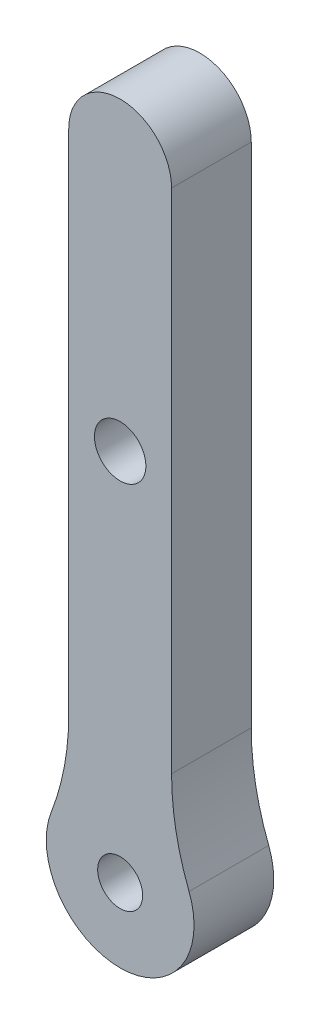
ISO-10303-21;
HEADER;
FILE_DESCRIPTION(('STEP AP214'),'2;1');
FILE_NAME('part.step','',(''),(''),'','','');
FILE_SCHEMA(('AUTOMOTIVE_DESIGN { 1 0 10303 214 1 1 1 1 }'));
ENDSEC;
DATA;
#1=APPLICATION_CONTEXT('core data for automotive mechanical design processes');
#2=APPLICATION_PROTOCOL_DEFINITION('international standard','automotive_design',2000,#1);
#3=PRODUCT_CONTEXT('',#1,'mechanical');
#4=PRODUCT('Part','Part','',(#3));
#5=PRODUCT_RELATED_PRODUCT_CATEGORY('part','',(#4));
#6=PRODUCT_DEFINITION_FORMATION('','',#4);
#7=PRODUCT_DEFINITION_CONTEXT('part definition',#1,'design');
#8=PRODUCT_DEFINITION('design','',#6,#7);
#9=PRODUCT_DEFINITION_SHAPE('','',#8);
#10=(LENGTH_UNIT() NAMED_UNIT(*) SI_UNIT(.MILLI.,.METRE.));
#11=(NAMED_UNIT(*) PLANE_ANGLE_UNIT() SI_UNIT($,.RADIAN.));
#12=(NAMED_UNIT(*) SI_UNIT($,.STERADIAN.) SOLID_ANGLE_UNIT());
#13=UNCERTAINTY_MEASURE_WITH_UNIT(LENGTH_MEASURE(1.E-05),#10,'distance_accuracy_value','');
#14=(GEOMETRIC_REPRESENTATION_CONTEXT(3) GLOBAL_UNCERTAINTY_ASSIGNED_CONTEXT((#13)) GLOBAL_UNIT_ASSIGNED_CONTEXT((#10,
#11,#12)) REPRESENTATION_CONTEXT('',''));
#15=CARTESIAN_POINT('',(0.,0.,0.));
#16=DIRECTION('',(0.,0.,1.));
#17=DIRECTION('',(1.,0.,0.));
#18=AXIS2_PLACEMENT_3D('',#15,#16,#17);
#19=CARTESIAN_POINT('',(-12.4206,30.988,41.8266177971288));
#20=DIRECTION('',(1.,0.,0.));
#21=DIRECTION('',(0.,1.,0.));
#22=AXIS2_PLACEMENT_3D('',#19,#20,#21);
#23=PLANE('',#22);
#24=DIRECTION('',(0.,-1.,0.));
#25=VECTOR('',#24,1.);
#26=CARTESIAN_POINT('',(-12.4206,30.988,3.937));
#27=LINE('',#26,#25);
#28=CARTESIAN_POINT('',(-12.4206,30.988,3.93700000000001));
#29=VERTEX_POINT('',#28);
#30=CARTESIAN_POINT('',(-12.4206,5.92501279007058,3.937));
#31=VERTEX_POINT('',#30);
#32=EDGE_CURVE('E89',#29,#31,#27,.T.);
#33=ORIENTED_EDGE('',*,*,#32,.F.);
#34=DIRECTION('',(0.,0.,-1.));
#35=VECTOR('',#34,1.);
#36=CARTESIAN_POINT('',(-12.4206,30.988,41.8266177971288));
#37=LINE('',#36,#35);
#38=CARTESIAN_POINT('',(-12.4206,30.988,0.));
#39=VERTEX_POINT('',#38);
#40=EDGE_CURVE('E49',#29,#39,#37,.T.);
#41=ORIENTED_EDGE('',*,*,#40,.T.);
#42=DIRECTION('',(0.,-1.,0.));
#43=VECTOR('',#42,1.);
#44=CARTESIAN_POINT('',(-12.4206,30.988,0.));
#45=LINE('',#44,#43);
#46=CARTESIAN_POINT('',(-12.4206,5.92501279007058,0.));
#47=VERTEX_POINT('',#46);
#48=EDGE_CURVE('E92',#39,#47,#45,.T.);
#49=ORIENTED_EDGE('',*,*,#48,.T.);
#50=DIRECTION('',(0.,0.,-1.));
#51=VECTOR('',#50,1.);
#52=CARTESIAN_POINT('',(-12.4206,5.92501279007058,41.8266177971288));
#53=LINE('',#52,#51);
#54=EDGE_CURVE('E86',#31,#47,#53,.T.);
#55=ORIENTED_EDGE('',*,*,#54,.F.);
#56=EDGE_LOOP('',(#33,#41,#49,#55));
#57=FACE_BOUND('',#56,.T.);
#58=ADVANCED_FACE('F33',(#57),#23,.F.);
#59=CARTESIAN_POINT('',(-9.88059999999999,30.988,41.8266177971288));
#60=DIRECTION('',(0.,0.,-1.));
#61=DIRECTION('',(-1.,0.,0.));
#62=AXIS2_PLACEMENT_3D('',#59,#60,#61);
#63=CYLINDRICAL_SURFACE('',#62,2.54);
#64=CARTESIAN_POINT('',(-9.88059999999999,30.988,3.937));
#65=DIRECTION('',(0.,0.,1.));
#66=DIRECTION('',(1.,0.,0.));
#67=AXIS2_PLACEMENT_3D('',#64,#65,#66);
#68=CIRCLE('',#67,2.54);
#69=CARTESIAN_POINT('',(-7.34059999999999,30.988,3.93700000000001));
#70=VERTEX_POINT('',#69);
#71=EDGE_CURVE('E104',#70,#29,#68,.T.);
#72=ORIENTED_EDGE('',*,*,#71,.F.);
#73=DIRECTION('',(0.,0.,-1.));
#74=VECTOR('',#73,1.);
#75=CARTESIAN_POINT('',(-7.34059999999999,30.988,41.8266177971288));
#76=LINE('',#75,#74);
#77=CARTESIAN_POINT('',(-7.34059999999999,30.988,0.));
#78=VERTEX_POINT('',#77);
#79=EDGE_CURVE('E136',#70,#78,#76,.T.);
#80=ORIENTED_EDGE('',*,*,#79,.T.);
#81=CARTESIAN_POINT('',(-9.88059999999999,30.988,0.));
#82=DIRECTION('',(0.,0.,1.));
#83=DIRECTION('',(1.,0.,0.));
#84=AXIS2_PLACEMENT_3D('',#81,#82,#83);
#85=CIRCLE('',#84,2.54);
#86=EDGE_CURVE('E132',#78,#39,#85,.T.);
#87=ORIENTED_EDGE('',*,*,#86,.T.);
#88=ORIENTED_EDGE('',*,*,#40,.F.);
#89=EDGE_LOOP('',(#72,#80,#87,#88));
#90=FACE_BOUND('',#89,.T.);
#91=ADVANCED_FACE('F154',(#90),#63,.T.);
#92=CARTESIAN_POINT('',(-7.3406,30.988,41.8266177971288));
#93=DIRECTION('',(-1.,0.,0.));
#94=DIRECTION('',(0.,-1.,0.));
#95=AXIS2_PLACEMENT_3D('',#92,#93,#94);
#96=PLANE('',#95);
#97=DIRECTION('',(0.,1.,0.));
#98=VECTOR('',#97,1.);
#99=CARTESIAN_POINT('',(-7.3406,30.988,3.937));
#100=LINE('',#99,#98);
#101=CARTESIAN_POINT('',(-7.34059999999997,5.92501279007047,3.93700000000001));
#102=VERTEX_POINT('',#101);
#103=EDGE_CURVE('E106',#102,#70,#100,.T.);
#104=ORIENTED_EDGE('',*,*,#103,.F.);
#105=DIRECTION('',(0.,0.,-1.));
#106=VECTOR('',#105,1.);
#107=CARTESIAN_POINT('',(-7.34059999999997,5.92501279007047,41.8266177971288));
#108=LINE('',#107,#106);
#109=CARTESIAN_POINT('',(-7.34059999999997,5.92501279007047,0.));
#110=VERTEX_POINT('',#109);
#111=EDGE_CURVE('E138',#102,#110,#108,.T.);
#112=ORIENTED_EDGE('',*,*,#111,.T.);
#113=DIRECTION('',(0.,1.,0.));
#114=VECTOR('',#113,1.);
#115=CARTESIAN_POINT('',(-7.3406,30.988,0.));
#116=LINE('',#115,#114);
#117=EDGE_CURVE('E129',#110,#78,#116,.T.);
#118=ORIENTED_EDGE('',*,*,#117,.T.);
#119=ORIENTED_EDGE('',*,*,#79,.F.);
#120=EDGE_LOOP('',(#104,#112,#118,#119));
#121=FACE_BOUND('',#120,.T.);
#122=ADVANCED_FACE('F153',(#121),#96,.F.);
#123=CARTESIAN_POINT('',(5.35940000000003,5.92501279007049,41.8266177971288));
#124=DIRECTION('',(0.,0.,-1.));
#125=DIRECTION('',(-1.,0.,0.));
#126=AXIS2_PLACEMENT_3D('',#123,#124,#125);
#127=CYLINDRICAL_SURFACE('',#126,12.7);
#128=CARTESIAN_POINT('',(5.35940000000003,5.92501279007049,3.937));
#129=DIRECTION('',(0.,0.,1.));
#130=DIRECTION('',(1.,0.,0.));
#131=AXIS2_PLACEMENT_3D('',#128,#129,#130);
#132=CIRCLE('',#131,12.7);
#133=CARTESIAN_POINT('',(-6.47749320388349,1.32306110846234,3.93700000000001));
#134=VERTEX_POINT('',#133);
#135=EDGE_CURVE('E115',#134,#102,#132,.F.);
#136=ORIENTED_EDGE('',*,*,#135,.F.);
#137=DIRECTION('',(0.,0.,-1.));
#138=VECTOR('',#137,1.);
#139=CARTESIAN_POINT('',(-6.47749320388349,1.32306110846234,41.8266177971288));
#140=LINE('',#139,#138);
#141=CARTESIAN_POINT('',(-6.47749320388349,1.32306110846234,0.));
#142=VERTEX_POINT('',#141);
#143=EDGE_CURVE('E42',#134,#142,#140,.T.);
#144=ORIENTED_EDGE('',*,*,#143,.T.);
#145=CARTESIAN_POINT('',(5.35940000000003,5.92501279007049,0.));
#146=DIRECTION('',(0.,0.,-1.));
#147=DIRECTION('',(1.,0.,0.));
#148=AXIS2_PLACEMENT_3D('',#145,#146,#147);
#149=CIRCLE('',#148,12.7);
#150=EDGE_CURVE('E126',#142,#110,#149,.T.);
#151=ORIENTED_EDGE('',*,*,#150,.T.);
#152=ORIENTED_EDGE('',*,*,#111,.F.);
#153=EDGE_LOOP('',(#136,#144,#151,#152));
#154=FACE_BOUND('',#153,.T.);
#155=ADVANCED_FACE('F141',(#154),#127,.F.);
#156=CARTESIAN_POINT('',(-9.8806,0.,41.8266177971288));
#157=DIRECTION('',(0.,0.,-1.));
#158=DIRECTION('',(-1.,0.,0.));
#159=AXIS2_PLACEMENT_3D('',#156,#157,#158);
#160=CYLINDRICAL_SURFACE('',#159,3.65125);
#161=CARTESIAN_POINT('',(-9.8806,0.,3.937));
#162=DIRECTION('',(0.,0.,1.));
#163=DIRECTION('',(1.,0.,0.));
#164=AXIS2_PLACEMENT_3D('',#161,#162,#163);
#165=CIRCLE('',#164,3.65125);
#166=CARTESIAN_POINT('',(-13.2837067961165,1.32306110846236,3.93700000000001));
#167=VERTEX_POINT('',#166);
#168=EDGE_CURVE('E56',#167,#134,#165,.T.);
#169=ORIENTED_EDGE('',*,*,#168,.F.);
#170=DIRECTION('',(0.,0.,-1.));
#171=VECTOR('',#170,1.);
#172=CARTESIAN_POINT('',(-13.2837067961165,1.32306110846236,41.8266177971288));
#173=LINE('',#172,#171);
#174=CARTESIAN_POINT('',(-13.2837067961165,1.32306110846236,0.));
#175=VERTEX_POINT('',#174);
#176=EDGE_CURVE('E11',#167,#175,#173,.T.);
#177=ORIENTED_EDGE('',*,*,#176,.T.);
#178=CARTESIAN_POINT('',(-9.8806,0.,0.));
#179=DIRECTION('',(0.,0.,1.));
#180=DIRECTION('',(1.,0.,0.));
#181=AXIS2_PLACEMENT_3D('',#178,#179,#180);
#182=CIRCLE('',#181,3.65125);
#183=EDGE_CURVE('E123',#175,#142,#182,.T.);
#184=ORIENTED_EDGE('',*,*,#183,.T.);
#185=ORIENTED_EDGE('',*,*,#143,.F.);
#186=EDGE_LOOP('',(#169,#177,#184,#185));
#187=FACE_BOUND('',#186,.T.);
#188=ADVANCED_FACE('F146',(#187),#160,.T.);
#189=CARTESIAN_POINT('',(-25.1206,5.92501279007058,41.8266177971288));
#190=DIRECTION('',(0.,0.,-1.));
#191=DIRECTION('',(-1.,0.,0.));
#192=AXIS2_PLACEMENT_3D('',#189,#190,#191);
#193=CYLINDRICAL_SURFACE('',#192,12.7);
#194=CARTESIAN_POINT('',(-25.1206,5.92501279007058,3.937));
#195=DIRECTION('',(0.,0.,1.));
#196=DIRECTION('',(1.,0.,0.));
#197=AXIS2_PLACEMENT_3D('',#194,#195,#196);
#198=CIRCLE('',#197,12.7);
#199=EDGE_CURVE('E98',#31,#167,#198,.F.);
#200=ORIENTED_EDGE('',*,*,#199,.F.);
#201=ORIENTED_EDGE('',*,*,#54,.T.);
#202=CARTESIAN_POINT('',(-25.1206,5.92501279007058,0.));
#203=DIRECTION('',(0.,0.,-1.));
#204=DIRECTION('',(-1.,0.,0.));
#205=AXIS2_PLACEMENT_3D('',#202,#203,#204);
#206=CIRCLE('',#205,12.7);
#207=EDGE_CURVE('E121',#47,#175,#206,.T.);
#208=ORIENTED_EDGE('',*,*,#207,.T.);
#209=ORIENTED_EDGE('',*,*,#176,.F.);
#210=EDGE_LOOP('',(#200,#201,#208,#209));
#211=FACE_BOUND('',#210,.T.);
#212=ADVANCED_FACE('F35',(#211),#193,.F.);
#213=CARTESIAN_POINT('',(-25.1206,5.92501279007058,0.));
#214=DIRECTION('',(0.,0.,-1.));
#215=DIRECTION('',(-1.,0.,0.));
#216=AXIS2_PLACEMENT_3D('',#213,#214,#215);
#217=PLANE('',#216);
#218=CARTESIAN_POINT('',(-9.8806,18.4565063950352,0.));
#219=DIRECTION('',(0.,0.,-1.));
#220=DIRECTION('',(-1.,0.,0.));
#221=AXIS2_PLACEMENT_3D('',#218,#219,#220);
#222=CIRCLE('',#221,1.27);
#223=CARTESIAN_POINT('',(-11.1506,18.4565063950352,0.));
#224=VERTEX_POINT('',#223);
#225=EDGE_CURVE('E111',#224,#224,#222,.T.);
#226=ORIENTED_EDGE('',*,*,#225,.F.);
#227=EDGE_LOOP('',(#226));
#228=FACE_BOUND('',#227,.T.);
#229=ORIENTED_EDGE('',*,*,#207,.F.);
#230=ORIENTED_EDGE('',*,*,#48,.F.);
#231=ORIENTED_EDGE('',*,*,#86,.F.);
#232=ORIENTED_EDGE('',*,*,#117,.F.);
#233=ORIENTED_EDGE('',*,*,#150,.F.);
#234=ORIENTED_EDGE('',*,*,#183,.F.);
#235=EDGE_LOOP('',(#229,#230,#231,#232,#233,#234));
#236=FACE_BOUND('',#235,.T.);
#237=CARTESIAN_POINT('',(-9.8806,0.,0.));
#238=DIRECTION('',(0.,0.,1.));
#239=DIRECTION('',(1.,0.,0.));
#240=AXIS2_PLACEMENT_3D('',#237,#238,#239);
#241=CIRCLE('',#240,1.11125);
#242=CARTESIAN_POINT('',(-10.99185,0.,0.));
#243=VERTEX_POINT('',#242);
#244=EDGE_CURVE('E100',#243,#243,#241,.T.);
#245=ORIENTED_EDGE('',*,*,#244,.T.);
#246=EDGE_LOOP('',(#245));
#247=FACE_BOUND('',#246,.T.);
#248=ADVANCED_FACE('F148',(#228,#236,#247),#217,.T.);
#249=CARTESIAN_POINT('',(-9.8806,0.,41.8266177971288));
#250=DIRECTION('',(0.,0.,-1.));
#251=DIRECTION('',(-1.,0.,0.));
#252=AXIS2_PLACEMENT_3D('',#249,#250,#251);
#253=CYLINDRICAL_SURFACE('',#252,1.11125);
#254=CARTESIAN_POINT('',(-9.8806,0.,3.937));
#255=DIRECTION('',(0.,0.,1.));
#256=DIRECTION('',(1.,0.,0.));
#257=AXIS2_PLACEMENT_3D('',#254,#255,#256);
#258=CIRCLE('',#257,1.11125);
#259=CARTESIAN_POINT('',(-10.99185,0.,3.93699999999999));
#260=VERTEX_POINT('',#259);
#261=EDGE_CURVE('E37',#260,#260,#258,.T.);
#262=CARTESIAN_POINT('',(-10.99185,0.,0.));
#263=CARTESIAN_POINT('',(-10.99185,0.,0.0410104166666605));
#264=CARTESIAN_POINT('',(-10.99185,0.,0.082020833333328));
#265=CARTESIAN_POINT('',(-10.99185,0.,0.164041666666661));
#266=CARTESIAN_POINT('',(-10.99185,0.,0.205052083333326));
#267=CARTESIAN_POINT('',(-10.99185,0.,0.287072916666659));
#268=CARTESIAN_POINT('',(-10.99185,0.,0.328083333333326));
#269=CARTESIAN_POINT('',(-10.99185,0.,0.410104166666659));
#270=CARTESIAN_POINT('',(-10.99185,0.,0.451114583333324));
#271=CARTESIAN_POINT('',(-10.99185,0.,0.533135416666657));
#272=CARTESIAN_POINT('',(-10.99185,0.,0.574145833333324));
#273=CARTESIAN_POINT('',(-10.99185,0.,0.656166666666659));
#274=CARTESIAN_POINT('',(-10.99185,0.,0.697177083333327));
#275=CARTESIAN_POINT('',(-10.99185,0.,0.779197916666659));
#276=CARTESIAN_POINT('',(-10.99185,0.,0.820208333333324));
#277=CARTESIAN_POINT('',(-10.99185,0.,0.902229166666657));
#278=CARTESIAN_POINT('',(-10.99185,0.,0.943239583333325));
#279=CARTESIAN_POINT('',(-10.99185,0.,1.02526041666666));
#280=CARTESIAN_POINT('',(-10.99185,0.,1.06627083333333));
#281=CARTESIAN_POINT('',(-10.99185,0.,1.14829166666666));
#282=CARTESIAN_POINT('',(-10.99185,0.,1.18930208333332));
#283=CARTESIAN_POINT('',(-10.99185,0.,1.27132291666666));
#284=CARTESIAN_POINT('',(-10.99185,0.,1.31233333333333));
#285=CARTESIAN_POINT('',(-10.99185,0.,1.39435416666666));
#286=CARTESIAN_POINT('',(-10.99185,0.,1.43536458333333));
#287=CARTESIAN_POINT('',(-10.99185,0.,1.51738541666666));
#288=CARTESIAN_POINT('',(-10.99185,0.,1.55839583333333));
#289=CARTESIAN_POINT('',(-10.99185,0.,1.64041666666666));
#290=CARTESIAN_POINT('',(-10.99185,0.,1.68142708333333));
#291=CARTESIAN_POINT('',(-10.99185,0.,1.76344791666666));
#292=CARTESIAN_POINT('',(-10.99185,0.,1.80445833333332));
#293=CARTESIAN_POINT('',(-10.99185,0.,1.88647916666666));
#294=CARTESIAN_POINT('',(-10.99185,0.,1.92748958333332));
#295=CARTESIAN_POINT('',(-10.99185,0.,2.00951041666666));
#296=CARTESIAN_POINT('',(-10.99185,0.,2.05052083333333));
#297=CARTESIAN_POINT('',(-10.99185,0.,2.13254166666666));
#298=CARTESIAN_POINT('',(-10.99185,0.,2.17355208333332));
#299=CARTESIAN_POINT('',(-10.99185,0.,2.25557291666666));
#300=CARTESIAN_POINT('',(-10.99185,0.,2.29658333333332));
#301=CARTESIAN_POINT('',(-10.99185,0.,2.37860416666666));
#302=CARTESIAN_POINT('',(-10.99185,0.,2.41961458333332));
#303=CARTESIAN_POINT('',(-10.99185,0.,2.50163541666665));
#304=CARTESIAN_POINT('',(-10.99185,0.,2.54264583333332));
#305=CARTESIAN_POINT('',(-10.99185,0.,2.62466666666666));
#306=CARTESIAN_POINT('',(-10.99185,0.,2.66567708333332));
#307=CARTESIAN_POINT('',(-10.99185,0.,2.74769791666666));
#308=CARTESIAN_POINT('',(-10.99185,0.,2.78870833333332));
#309=CARTESIAN_POINT('',(-10.99185,0.,2.87072916666666));
#310=CARTESIAN_POINT('',(-10.99185,0.,2.91173958333332));
#311=CARTESIAN_POINT('',(-10.99185,0.,2.99376041666666));
#312=CARTESIAN_POINT('',(-10.99185,0.,3.03477083333332));
#313=CARTESIAN_POINT('',(-10.99185,0.,3.11679166666666));
#314=CARTESIAN_POINT('',(-10.99185,0.,3.15780208333332));
#315=CARTESIAN_POINT('',(-10.99185,0.,3.23982291666666));
#316=CARTESIAN_POINT('',(-10.99185,0.,3.28083333333332));
#317=CARTESIAN_POINT('',(-10.99185,0.,3.36285416666666));
#318=CARTESIAN_POINT('',(-10.99185,0.,3.40386458333333));
#319=CARTESIAN_POINT('',(-10.99185,0.,3.48588541666666));
#320=CARTESIAN_POINT('',(-10.99185,0.,3.52689583333332));
#321=CARTESIAN_POINT('',(-10.99185,0.,3.60891666666666));
#322=CARTESIAN_POINT('',(-10.99185,0.,3.64992708333332));
#323=CARTESIAN_POINT('',(-10.99185,0.,3.73194791666666));
#324=CARTESIAN_POINT('',(-10.99185,0.,3.77295833333332));
#325=CARTESIAN_POINT('',(-10.99185,0.,3.85497916666665));
#326=CARTESIAN_POINT('',(-10.99185,0.,3.89598958333332));
#327=CARTESIAN_POINT('',(-10.99185,0.,3.93699999999999));
#328=B_SPLINE_CURVE_WITH_KNOTS('',3,(#262,#263,#264,#265,#266,#267,#268,#269,#270,#271,#272,
#273,#274,#275,#276,#277,#278,#279,#280,#281,#282,#283,#284,#285,#286,#287,#288,#289,#290,#291,
#292,#293,#294,#295,#296,#297,#298,#299,#300,#301,#302,#303,#304,#305,#306,#307,#308,#309,#310,
#311,#312,#313,#314,#315,#316,#317,#318,#319,#320,#321,#322,#323,#324,#325,#326,#327),
.UNSPECIFIED.,.F.,.F.,(4,2,2,2,2,2,2,2,2,2,2,2,2,2,2,2,2,2,2,2,2,2,2,2,2,2,2,2,2,2,2,2,4),(0.,
0.123031250000002,0.246062499999998,0.36909375,0.492124999999996,0.615156249999999,
0.738187500000001,0.861218749999997,0.984249999999999,1.10728125,1.2303125,1.35334375,1.476375,
1.59940625,1.7224375,1.84546875,1.9685,2.09153125,2.2145625,2.33759375,2.46062499999999,
2.58365625,2.7066875,2.82971874999999,2.95275,3.07578125,3.19881249999999,3.32184375,3.444875,
3.56790625,3.6909375,3.81396874999999,3.937),.UNSPECIFIED.);
#329=EDGE_CURVE('BSEAM173',#243,#260,#328,.T.);
#330=ORIENTED_EDGE('',*,*,#244,.F.);
#331=ORIENTED_EDGE('',*,*,#261,.T.);
#332=ORIENTED_EDGE('',*,*,#329,.T.);
#333=ORIENTED_EDGE('',*,*,#329,.F.);
#334=EDGE_LOOP('',(#330,#332,#331,#333));
#335=FACE_BOUND('',#334,.T.);
#336=ADVANCED_FACE('F173',(#335),#253,.F.);
#337=CARTESIAN_POINT('',(-9.8806,0.,3.937));
#338=DIRECTION('',(0.,0.,1.));
#339=DIRECTION('',(0.,-1.,0.));
#340=AXIS2_PLACEMENT_3D('',#337,#338,#339);
#341=PLANE('',#340);
#342=CARTESIAN_POINT('',(-9.8806,18.4565063950352,3.93700000000001));
#343=DIRECTION('',(0.,0.,-1.));
#344=DIRECTION('',(-1.,0.,0.));
#345=AXIS2_PLACEMENT_3D('',#342,#343,#344);
#346=CIRCLE('',#345,1.27);
#347=CARTESIAN_POINT('',(-11.1506,18.4565063950352,3.93700000000001));
#348=VERTEX_POINT('',#347);
#349=EDGE_CURVE('E109',#348,#348,#346,.T.);
#350=ORIENTED_EDGE('',*,*,#349,.T.);
#351=EDGE_LOOP('',(#350));
#352=FACE_BOUND('',#351,.T.);
#353=ORIENTED_EDGE('',*,*,#261,.F.);
#354=EDGE_LOOP('',(#353));
#355=FACE_BOUND('',#354,.T.);
#356=ORIENTED_EDGE('',*,*,#32,.T.);
#357=ORIENTED_EDGE('',*,*,#199,.T.);
#358=ORIENTED_EDGE('',*,*,#168,.T.);
#359=ORIENTED_EDGE('',*,*,#135,.T.);
#360=ORIENTED_EDGE('',*,*,#103,.T.);
#361=ORIENTED_EDGE('',*,*,#71,.T.);
#362=EDGE_LOOP('',(#356,#357,#358,#359,#360,#361));
#363=FACE_BOUND('',#362,.T.);
#364=ADVANCED_FACE('F102',(#352,#355,#363),#341,.T.);
#365=CARTESIAN_POINT('',(-9.8806,18.4565063950352,3.93700000000001));
#366=DIRECTION('',(0.,0.,-1.));
#367=DIRECTION('',(-1.,0.,0.));
#368=AXIS2_PLACEMENT_3D('',#365,#366,#367);
#369=CYLINDRICAL_SURFACE('',#368,1.27);
#370=ORIENTED_EDGE('',*,*,#349,.F.);
#371=EDGE_LOOP('',(#370));
#372=FACE_BOUND('',#371,.T.);
#373=ORIENTED_EDGE('',*,*,#225,.T.);
#374=EDGE_LOOP('',(#373));
#375=FACE_BOUND('',#374,.T.);
#376=ADVANCED_FACE('F184',(#372,#375),#369,.F.);
#377=CLOSED_SHELL('',(#58,#91,#122,#155,#188,#212,#248,#336,#364,#376));
#378=MANIFOLD_SOLID_BREP('B2',#377);
#379=ADVANCED_BREP_SHAPE_REPRESENTATION('',(#18,#378),#14);
#380=SHAPE_DEFINITION_REPRESENTATION(#9,#379);
ENDSEC;
END-ISO-10303-21;
